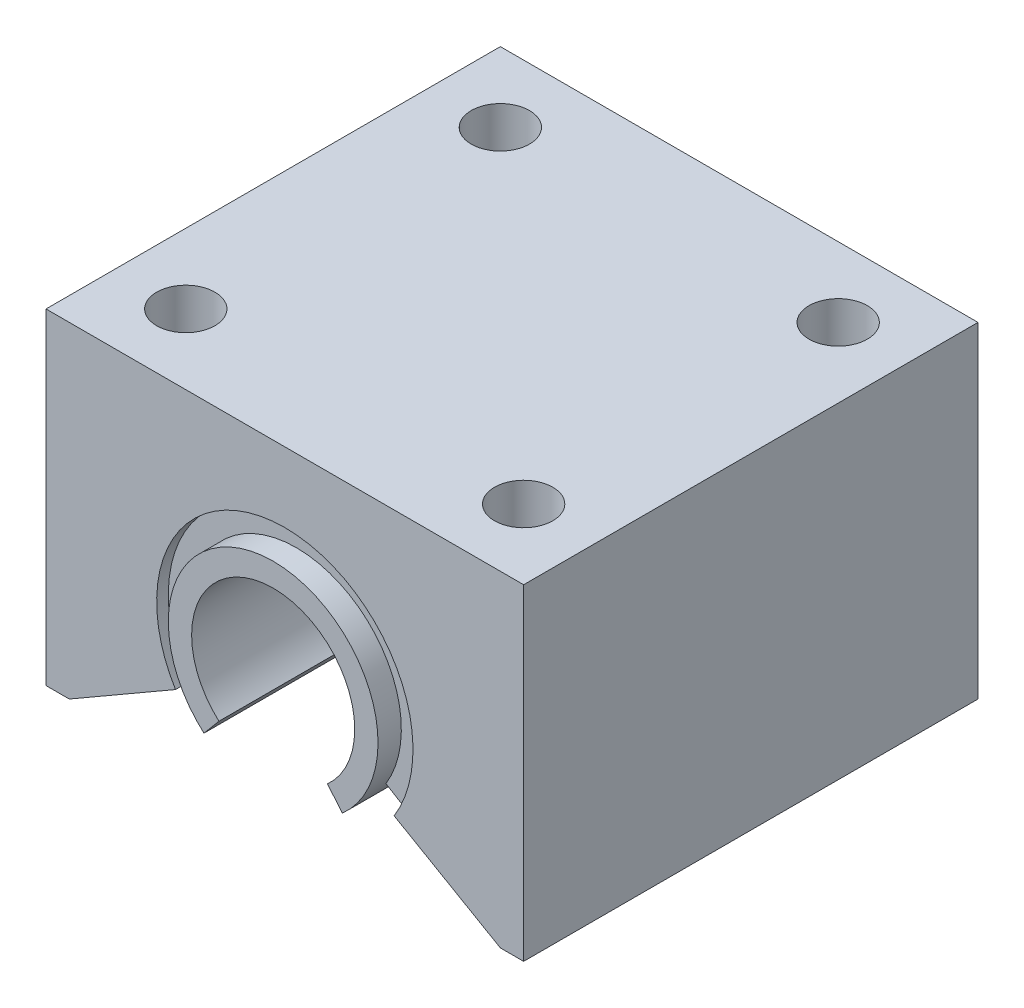
ISO-10303-21;
HEADER;
FILE_DESCRIPTION(('STEP AP214'),'2;1');
FILE_NAME('part.step','',(''),(''),'','','');
FILE_SCHEMA(('AUTOMOTIVE_DESIGN { 1 0 10303 214 1 1 1 1 }'));
ENDSEC;
DATA;
#1=APPLICATION_CONTEXT('core data for automotive mechanical design processes');
#2=APPLICATION_PROTOCOL_DEFINITION('international standard','automotive_design',2000,#1);
#3=PRODUCT_CONTEXT('',#1,'mechanical');
#4=PRODUCT('Part','Part','',(#3));
#5=PRODUCT_RELATED_PRODUCT_CATEGORY('part','',(#4));
#6=PRODUCT_DEFINITION_FORMATION('','',#4);
#7=PRODUCT_DEFINITION_CONTEXT('part definition',#1,'design');
#8=PRODUCT_DEFINITION('design','',#6,#7);
#9=PRODUCT_DEFINITION_SHAPE('','',#8);
#10=(LENGTH_UNIT() NAMED_UNIT(*) SI_UNIT(.MILLI.,.METRE.));
#11=(NAMED_UNIT(*) PLANE_ANGLE_UNIT() SI_UNIT($,.RADIAN.));
#12=(NAMED_UNIT(*) SI_UNIT($,.STERADIAN.) SOLID_ANGLE_UNIT());
#13=UNCERTAINTY_MEASURE_WITH_UNIT(LENGTH_MEASURE(1.E-05),#10,'distance_accuracy_value','');
#14=(GEOMETRIC_REPRESENTATION_CONTEXT(3) GLOBAL_UNCERTAINTY_ASSIGNED_CONTEXT((#13)) GLOBAL_UNIT_ASSIGNED_CONTEXT((#10,
#11,#12)) REPRESENTATION_CONTEXT('',''));
#15=CARTESIAN_POINT('',(0.,0.,0.));
#16=DIRECTION('',(0.,0.,1.));
#17=DIRECTION('',(1.,0.,0.));
#18=AXIS2_PLACEMENT_3D('',#15,#16,#17);
#19=CARTESIAN_POINT('',(0.,-3.,39.));
#20=DIRECTION('',(0.,0.,-1.));
#21=DIRECTION('',(-1.,0.,0.));
#22=AXIS2_PLACEMENT_3D('',#19,#20,#21);
#23=CYLINDRICAL_SURFACE('',#22,11.);
#24=CARTESIAN_POINT('',(0.,-3.,1.));
#25=DIRECTION('',(0.,0.,1.));
#26=DIRECTION('',(1.,0.,0.));
#27=AXIS2_PLACEMENT_3D('',#24,#25,#26);
#28=CIRCLE('',#27,11.);
#29=CARTESIAN_POINT('',(9.38513451930909,-8.73752996109588,1.));
#30=VERTEX_POINT('',#29);
#31=CARTESIAN_POINT('',(-9.38513451930909,-8.73752996109588,1.));
#32=VERTEX_POINT('',#31);
#33=EDGE_CURVE('E59',#30,#32,#28,.T.);
#34=ORIENTED_EDGE('',*,*,#33,.T.);
#35=DIRECTION('',(0.,0.,-1.));
#36=VECTOR('',#35,1.);
#37=CARTESIAN_POINT('',(-9.38513451930909,-8.73752996109588,39.));
#38=LINE('',#37,#36);
#39=CARTESIAN_POINT('',(-9.38513451930909,-8.73752996109588,0.));
#40=VERTEX_POINT('',#39);
#41=EDGE_CURVE('E150',#32,#40,#38,.T.);
#42=ORIENTED_EDGE('',*,*,#41,.T.);
#43=CARTESIAN_POINT('',(0.,-3.,0.));
#44=DIRECTION('',(0.,0.,-1.));
#45=DIRECTION('',(1.,0.,0.));
#46=AXIS2_PLACEMENT_3D('',#43,#44,#45);
#47=CIRCLE('',#46,11.);
#48=CARTESIAN_POINT('',(9.38513451930909,-8.73752996109588,0.));
#49=VERTEX_POINT('',#48);
#50=EDGE_CURVE('E181',#40,#49,#47,.T.);
#51=ORIENTED_EDGE('',*,*,#50,.T.);
#52=DIRECTION('',(0.,0.,-1.));
#53=VECTOR('',#52,1.);
#54=CARTESIAN_POINT('',(9.38513451930909,-8.73752996109588,39.));
#55=LINE('',#54,#53);
#56=EDGE_CURVE('E190',#30,#49,#55,.T.);
#57=ORIENTED_EDGE('',*,*,#56,.F.);
#58=EDGE_LOOP('',(#34,#42,#51,#57));
#59=FACE_BOUND('',#58,.T.);
#60=ADVANCED_FACE('F43',(#59),#23,.F.);
#61=CARTESIAN_POINT('',(18.5,-14.,39.));
#62=DIRECTION('',(0.,1.,0.));
#63=DIRECTION('',(-1.,0.,0.));
#64=AXIS2_PLACEMENT_3D('',#61,#62,#63);
#65=PLANE('',#64);
#66=DIRECTION('',(1.,0.,0.));
#67=VECTOR('',#66,1.);
#68=CARTESIAN_POINT('',(18.5,-14.,0.));
#69=LINE('',#68,#67);
#70=CARTESIAN_POINT('',(18.5,-14.,0.));
#71=VERTEX_POINT('',#70);
#72=CARTESIAN_POINT('',(20.5,-14.,0.));
#73=VERTEX_POINT('',#72);
#74=EDGE_CURVE('E162',#71,#73,#69,.T.);
#75=ORIENTED_EDGE('',*,*,#74,.T.);
#76=DIRECTION('',(0.,0.,-1.));
#77=VECTOR('',#76,1.);
#78=CARTESIAN_POINT('',(20.5,-14.,39.));
#79=LINE('',#78,#77);
#80=CARTESIAN_POINT('',(20.5,-14.,39.));
#81=VERTEX_POINT('',#80);
#82=EDGE_CURVE('E11',#81,#73,#79,.T.);
#83=ORIENTED_EDGE('',*,*,#82,.F.);
#84=DIRECTION('',(1.,0.,0.));
#85=VECTOR('',#84,1.);
#86=CARTESIAN_POINT('',(18.5,-14.,39.));
#87=LINE('',#86,#85);
#88=CARTESIAN_POINT('',(18.5,-14.,39.));
#89=VERTEX_POINT('',#88);
#90=EDGE_CURVE('E187',#89,#81,#87,.T.);
#91=ORIENTED_EDGE('',*,*,#90,.F.);
#92=DIRECTION('',(0.,0.,-1.));
#93=VECTOR('',#92,1.);
#94=CARTESIAN_POINT('',(18.5,-14.,39.));
#95=LINE('',#94,#93);
#96=EDGE_CURVE('E158',#89,#71,#95,.T.);
#97=ORIENTED_EDGE('',*,*,#96,.T.);
#98=EDGE_LOOP('',(#75,#83,#91,#97));
#99=FACE_BOUND('',#98,.T.);
#100=ADVANCED_FACE('F45',(#99),#65,.F.);
#101=CARTESIAN_POINT('',(20.5,14.,39.));
#102=DIRECTION('',(-1.,0.,0.));
#103=DIRECTION('',(0.,-1.,0.));
#104=AXIS2_PLACEMENT_3D('',#101,#102,#103);
#105=PLANE('',#104);
#106=DIRECTION('',(0.,1.,0.));
#107=VECTOR('',#106,1.);
#108=CARTESIAN_POINT('',(20.5,14.,0.));
#109=LINE('',#108,#107);
#110=CARTESIAN_POINT('',(20.5,14.,0.));
#111=VERTEX_POINT('',#110);
#112=EDGE_CURVE('E166',#73,#111,#109,.T.);
#113=ORIENTED_EDGE('',*,*,#112,.T.);
#114=DIRECTION('',(0.,0.,-1.));
#115=VECTOR('',#114,1.);
#116=CARTESIAN_POINT('',(20.5,14.,39.));
#117=LINE('',#116,#115);
#118=CARTESIAN_POINT('',(20.5,14.,39.));
#119=VERTEX_POINT('',#118);
#120=EDGE_CURVE('E52',#119,#111,#117,.T.);
#121=ORIENTED_EDGE('',*,*,#120,.F.);
#122=DIRECTION('',(0.,1.,0.));
#123=VECTOR('',#122,1.);
#124=CARTESIAN_POINT('',(20.5,14.,39.));
#125=LINE('',#124,#123);
#126=EDGE_CURVE('E108',#81,#119,#125,.T.);
#127=ORIENTED_EDGE('',*,*,#126,.F.);
#128=ORIENTED_EDGE('',*,*,#82,.T.);
#129=EDGE_LOOP('',(#113,#121,#127,#128));
#130=FACE_BOUND('',#129,.T.);
#131=ADVANCED_FACE('F423',(#130),#105,.F.);
#132=CARTESIAN_POINT('',(-20.5,14.,39.));
#133=DIRECTION('',(0.,-1.,0.));
#134=DIRECTION('',(0.,0.,-1.));
#135=AXIS2_PLACEMENT_3D('',#132,#133,#134);
#136=PLANE('',#135);
#137=CARTESIAN_POINT('',(-14.4999987013249,14.,33.));
#138=DIRECTION('',(0.,1.,0.));
#139=DIRECTION('',(0.,0.,1.));
#140=AXIS2_PLACEMENT_3D('',#137,#138,#139);
#141=CIRCLE('',#140,2.5);
#142=CARTESIAN_POINT('',(-14.4999987013249,14.,35.5));
#143=VERTEX_POINT('',#142);
#144=EDGE_CURVE('E333',#143,#143,#141,.T.);
#145=ORIENTED_EDGE('',*,*,#144,.F.);
#146=EDGE_LOOP('',(#145));
#147=FACE_BOUND('',#146,.T.);
#148=CARTESIAN_POINT('',(14.5,14.,33.));
#149=DIRECTION('',(0.,1.,0.));
#150=DIRECTION('',(0.,0.,1.));
#151=AXIS2_PLACEMENT_3D('',#148,#149,#150);
#152=CIRCLE('',#151,2.5);
#153=CARTESIAN_POINT('',(14.5,14.,35.5));
#154=VERTEX_POINT('',#153);
#155=EDGE_CURVE('E342',#154,#154,#152,.T.);
#156=ORIENTED_EDGE('',*,*,#155,.F.);
#157=EDGE_LOOP('',(#156));
#158=FACE_BOUND('',#157,.T.);
#159=CARTESIAN_POINT('',(14.4999987013249,14.,6.));
#160=DIRECTION('',(0.,1.,0.));
#161=DIRECTION('',(0.,0.,1.));
#162=AXIS2_PLACEMENT_3D('',#159,#160,#161);
#163=CIRCLE('',#162,2.5);
#164=CARTESIAN_POINT('',(14.4999987013249,14.,8.5));
#165=VERTEX_POINT('',#164);
#166=EDGE_CURVE('E350',#165,#165,#163,.T.);
#167=ORIENTED_EDGE('',*,*,#166,.F.);
#168=EDGE_LOOP('',(#167));
#169=FACE_BOUND('',#168,.T.);
#170=CARTESIAN_POINT('',(-14.5,14.,6.));
#171=DIRECTION('',(0.,1.,0.));
#172=DIRECTION('',(0.,0.,1.));
#173=AXIS2_PLACEMENT_3D('',#170,#171,#172);
#174=CIRCLE('',#173,2.5);
#175=CARTESIAN_POINT('',(-14.5,14.,8.5));
#176=VERTEX_POINT('',#175);
#177=EDGE_CURVE('E325',#176,#176,#174,.T.);
#178=ORIENTED_EDGE('',*,*,#177,.F.);
#179=EDGE_LOOP('',(#178));
#180=FACE_BOUND('',#179,.T.);
#181=DIRECTION('',(-1.,0.,0.));
#182=VECTOR('',#181,1.);
#183=CARTESIAN_POINT('',(-20.5,14.,0.));
#184=LINE('',#183,#182);
#185=CARTESIAN_POINT('',(-20.5,14.,0.));
#186=VERTEX_POINT('',#185);
#187=EDGE_CURVE('E169',#111,#186,#184,.T.);
#188=ORIENTED_EDGE('',*,*,#187,.T.);
#189=DIRECTION('',(0.,0.,-1.));
#190=VECTOR('',#189,1.);
#191=CARTESIAN_POINT('',(-20.5,14.,39.));
#192=LINE('',#191,#190);
#193=CARTESIAN_POINT('',(-20.5,14.,39.));
#194=VERTEX_POINT('',#193);
#195=EDGE_CURVE('E199',#194,#186,#192,.T.);
#196=ORIENTED_EDGE('',*,*,#195,.F.);
#197=DIRECTION('',(-1.,0.,0.));
#198=VECTOR('',#197,1.);
#199=CARTESIAN_POINT('',(-20.5,14.,39.));
#200=LINE('',#199,#198);
#201=EDGE_CURVE('E209',#119,#194,#200,.T.);
#202=ORIENTED_EDGE('',*,*,#201,.F.);
#203=ORIENTED_EDGE('',*,*,#120,.T.);
#204=EDGE_LOOP('',(#188,#196,#202,#203));
#205=FACE_BOUND('',#204,.T.);
#206=ADVANCED_FACE('F207',(#147,#158,#169,#180,#205),#136,.F.);
#207=CARTESIAN_POINT('',(-20.5,14.,39.));
#208=DIRECTION('',(1.,0.,0.));
#209=DIRECTION('',(0.,1.,0.));
#210=AXIS2_PLACEMENT_3D('',#207,#208,#209);
#211=PLANE('',#210);
#212=DIRECTION('',(0.,-1.,0.));
#213=VECTOR('',#212,1.);
#214=CARTESIAN_POINT('',(-20.5,14.,0.));
#215=LINE('',#214,#213);
#216=CARTESIAN_POINT('',(-20.5,-14.,0.));
#217=VERTEX_POINT('',#216);
#218=EDGE_CURVE('E172',#186,#217,#215,.T.);
#219=ORIENTED_EDGE('',*,*,#218,.T.);
#220=DIRECTION('',(0.,0.,-1.));
#221=VECTOR('',#220,1.);
#222=CARTESIAN_POINT('',(-20.5,-14.,39.));
#223=LINE('',#222,#221);
#224=CARTESIAN_POINT('',(-20.5,-14.,39.));
#225=VERTEX_POINT('',#224);
#226=EDGE_CURVE('E195',#225,#217,#223,.T.);
#227=ORIENTED_EDGE('',*,*,#226,.F.);
#228=DIRECTION('',(0.,-1.,0.));
#229=VECTOR('',#228,1.);
#230=CARTESIAN_POINT('',(-20.5,14.,39.));
#231=LINE('',#230,#229);
#232=EDGE_CURVE('E223',#194,#225,#231,.T.);
#233=ORIENTED_EDGE('',*,*,#232,.F.);
#234=ORIENTED_EDGE('',*,*,#195,.T.);
#235=EDGE_LOOP('',(#219,#227,#233,#234));
#236=FACE_BOUND('',#235,.T.);
#237=ADVANCED_FACE('F218',(#236),#211,.F.);
#238=CARTESIAN_POINT('',(-20.5,-14.,39.));
#239=DIRECTION('',(0.,1.,0.));
#240=DIRECTION('',(-1.,0.,0.));
#241=AXIS2_PLACEMENT_3D('',#238,#239,#240);
#242=PLANE('',#241);
#243=DIRECTION('',(1.,0.,0.));
#244=VECTOR('',#243,1.);
#245=CARTESIAN_POINT('',(-20.5,-14.,0.));
#246=LINE('',#245,#244);
#247=CARTESIAN_POINT('',(-18.5,-14.,0.));
#248=VERTEX_POINT('',#247);
#249=EDGE_CURVE('E175',#217,#248,#246,.T.);
#250=ORIENTED_EDGE('',*,*,#249,.T.);
#251=DIRECTION('',(0.,0.,-1.));
#252=VECTOR('',#251,1.);
#253=CARTESIAN_POINT('',(-18.5,-14.,39.));
#254=LINE('',#253,#252);
#255=CARTESIAN_POINT('',(-18.5,-14.,39.));
#256=VERTEX_POINT('',#255);
#257=EDGE_CURVE('E149',#256,#248,#254,.T.);
#258=ORIENTED_EDGE('',*,*,#257,.F.);
#259=DIRECTION('',(1.,0.,0.));
#260=VECTOR('',#259,1.);
#261=CARTESIAN_POINT('',(-20.5,-14.,39.));
#262=LINE('',#261,#260);
#263=EDGE_CURVE('E131',#225,#256,#262,.T.);
#264=ORIENTED_EDGE('',*,*,#263,.F.);
#265=ORIENTED_EDGE('',*,*,#226,.T.);
#266=EDGE_LOOP('',(#250,#258,#264,#265));
#267=FACE_BOUND('',#266,.T.);
#268=ADVANCED_FACE('F221',(#267),#242,.F.);
#269=CARTESIAN_POINT('',(-18.5,-14.,39.));
#270=DIRECTION('',(-0.5,0.866025403784439,0.));
#271=DIRECTION('',(-0.866025403784439,-0.5,0.));
#272=AXIS2_PLACEMENT_3D('',#269,#270,#271);
#273=PLANE('',#272);
#274=DIRECTION('',(0.866025403784439,0.5,0.));
#275=VECTOR('',#274,1.);
#276=CARTESIAN_POINT('',(-18.5,-14.,0.));
#277=LINE('',#276,#275);
#278=EDGE_CURVE('E178',#248,#40,#277,.T.);
#279=ORIENTED_EDGE('',*,*,#278,.T.);
#280=ORIENTED_EDGE('',*,*,#41,.F.);
#281=DIRECTION('',(0.,0.,-1.));
#282=VECTOR('',#281,1.);
#283=CARTESIAN_POINT('',(-9.38513451930909,-8.73752996109588,38.));
#284=LINE('',#283,#282);
#285=CARTESIAN_POINT('',(-9.38513451930909,-8.73752996109588,38.));
#286=VERTEX_POINT('',#285);
#287=EDGE_CURVE('E145',#286,#32,#284,.T.);
#288=ORIENTED_EDGE('',*,*,#287,.F.);
#289=CARTESIAN_POINT('',(-9.38513451930909,-8.73752996109588,39.));
#290=VERTEX_POINT('',#289);
#291=EDGE_CURVE('E139',#290,#286,#38,.T.);
#292=ORIENTED_EDGE('',*,*,#291,.F.);
#293=DIRECTION('',(0.866025403784439,0.5,0.));
#294=VECTOR('',#293,1.);
#295=CARTESIAN_POINT('',(-18.5,-14.,39.));
#296=LINE('',#295,#294);
#297=EDGE_CURVE('E124',#256,#290,#296,.T.);
#298=ORIENTED_EDGE('',*,*,#297,.F.);
#299=ORIENTED_EDGE('',*,*,#257,.T.);
#300=EDGE_LOOP('',(#279,#280,#288,#292,#298,#299));
#301=FACE_BOUND('',#300,.T.);
#302=ADVANCED_FACE('F141',(#301),#273,.F.);
#303=ORIENTED_EDGE('',*,*,#291,.T.);
#304=CARTESIAN_POINT('',(0.,-3.,38.));
#305=DIRECTION('',(0.,0.,1.));
#306=DIRECTION('',(1.,0.,0.));
#307=AXIS2_PLACEMENT_3D('',#304,#305,#306);
#308=CIRCLE('',#307,11.);
#309=CARTESIAN_POINT('',(9.38513451930905,-8.73752996109594,38.));
#310=VERTEX_POINT('',#309);
#311=EDGE_CURVE('E251',#310,#286,#308,.T.);
#312=ORIENTED_EDGE('',*,*,#311,.F.);
#313=CARTESIAN_POINT('',(9.38513451930909,-8.73752996109588,39.));
#314=VERTEX_POINT('',#313);
#315=EDGE_CURVE('E154',#314,#310,#55,.T.);
#316=ORIENTED_EDGE('',*,*,#315,.F.);
#317=CARTESIAN_POINT('',(0.,-3.,39.));
#318=DIRECTION('',(0.,0.,-1.));
#319=DIRECTION('',(1.,0.,0.));
#320=AXIS2_PLACEMENT_3D('',#317,#318,#319);
#321=CIRCLE('',#320,11.);
#322=EDGE_CURVE('E128',#290,#314,#321,.T.);
#323=ORIENTED_EDGE('',*,*,#322,.F.);
#324=EDGE_LOOP('',(#303,#312,#316,#323));
#325=FACE_BOUND('',#324,.T.);
#326=ADVANCED_FACE('F152',(#325),#23,.F.);
#327=CARTESIAN_POINT('',(18.5,-14.,39.));
#328=DIRECTION('',(0.500000000000001,0.866025403784438,0.));
#329=DIRECTION('',(-0.866025403784438,0.500000000000001,0.));
#330=AXIS2_PLACEMENT_3D('',#327,#328,#329);
#331=PLANE('',#330);
#332=DIRECTION('',(0.866025403784438,-0.500000000000001,0.));
#333=VECTOR('',#332,1.);
#334=CARTESIAN_POINT('',(18.5,-14.,0.));
#335=LINE('',#334,#333);
#336=EDGE_CURVE('E100',#49,#71,#335,.T.);
#337=ORIENTED_EDGE('',*,*,#336,.T.);
#338=ORIENTED_EDGE('',*,*,#96,.F.);
#339=DIRECTION('',(0.866025403784438,-0.500000000000001,0.));
#340=VECTOR('',#339,1.);
#341=CARTESIAN_POINT('',(18.5,-14.,39.));
#342=LINE('',#341,#340);
#343=EDGE_CURVE('E68',#314,#89,#342,.T.);
#344=ORIENTED_EDGE('',*,*,#343,.F.);
#345=ORIENTED_EDGE('',*,*,#315,.T.);
#346=DIRECTION('',(0.,0.,-1.));
#347=VECTOR('',#346,1.);
#348=CARTESIAN_POINT('',(9.38513451930905,-8.73752996109594,38.));
#349=LINE('',#348,#347);
#350=EDGE_CURVE('E243',#310,#30,#349,.T.);
#351=ORIENTED_EDGE('',*,*,#350,.T.);
#352=ORIENTED_EDGE('',*,*,#56,.T.);
#353=EDGE_LOOP('',(#337,#338,#344,#345,#351,#352));
#354=FACE_BOUND('',#353,.T.);
#355=ADVANCED_FACE('F459',(#354),#331,.F.);
#356=CARTESIAN_POINT('',(0.,-3.,39.));
#357=DIRECTION('',(0.,0.,1.));
#358=DIRECTION('',(1.,0.,0.));
#359=AXIS2_PLACEMENT_3D('',#356,#357,#358);
#360=PLANE('',#359);
#361=ORIENTED_EDGE('',*,*,#90,.T.);
#362=ORIENTED_EDGE('',*,*,#126,.T.);
#363=ORIENTED_EDGE('',*,*,#201,.T.);
#364=ORIENTED_EDGE('',*,*,#232,.T.);
#365=ORIENTED_EDGE('',*,*,#263,.T.);
#366=ORIENTED_EDGE('',*,*,#297,.T.);
#367=ORIENTED_EDGE('',*,*,#322,.T.);
#368=ORIENTED_EDGE('',*,*,#343,.T.);
#369=EDGE_LOOP('',(#361,#362,#363,#364,#365,#366,#367,#368));
#370=FACE_BOUND('',#369,.T.);
#371=ADVANCED_FACE('F126',(#370),#360,.T.);
#372=CARTESIAN_POINT('',(0.,-3.,0.));
#373=DIRECTION('',(0.,0.,1.));
#374=DIRECTION('',(1.,0.,0.));
#375=AXIS2_PLACEMENT_3D('',#372,#373,#374);
#376=PLANE('',#375);
#377=ORIENTED_EDGE('',*,*,#74,.F.);
#378=ORIENTED_EDGE('',*,*,#336,.F.);
#379=ORIENTED_EDGE('',*,*,#50,.F.);
#380=ORIENTED_EDGE('',*,*,#278,.F.);
#381=ORIENTED_EDGE('',*,*,#249,.F.);
#382=ORIENTED_EDGE('',*,*,#218,.F.);
#383=ORIENTED_EDGE('',*,*,#187,.F.);
#384=ORIENTED_EDGE('',*,*,#112,.F.);
#385=EDGE_LOOP('',(#377,#378,#379,#380,#381,#382,#383,#384));
#386=FACE_BOUND('',#385,.T.);
#387=ADVANCED_FACE('F213',(#386),#376,.F.);
#388=CARTESIAN_POINT('',(-9.38513451930909,-8.73752996109588,38.));
#389=DIRECTION('',(-0.521593632826898,0.853194047209918,0.));
#390=DIRECTION('',(-0.853194047209918,-0.521593632826898,0.));
#391=AXIS2_PLACEMENT_3D('',#388,#389,#390);
#392=PLANE('',#391);
#393=DIRECTION('',(0.853194047209918,0.521593632826898,0.));
#394=VECTOR('',#393,1.);
#395=CARTESIAN_POINT('',(-9.38513451930909,-8.73752996109588,1.));
#396=LINE('',#395,#394);
#397=CARTESIAN_POINT('',(-7.67874642488926,-7.69434269544209,1.));
#398=VERTEX_POINT('',#397);
#399=EDGE_CURVE('E256',#32,#398,#396,.T.);
#400=ORIENTED_EDGE('',*,*,#399,.T.);
#401=DIRECTION('',(0.,0.,-1.));
#402=VECTOR('',#401,1.);
#403=CARTESIAN_POINT('',(-7.67874642488926,-7.69434269544209,38.));
#404=LINE('',#403,#402);
#405=CARTESIAN_POINT('',(-7.67874642488926,-7.69434269544209,38.));
#406=VERTEX_POINT('',#405);
#407=EDGE_CURVE('E235',#406,#398,#404,.T.);
#408=ORIENTED_EDGE('',*,*,#407,.F.);
#409=DIRECTION('',(0.853194047209918,0.521593632826898,0.));
#410=VECTOR('',#409,1.);
#411=CARTESIAN_POINT('',(-9.38513451930909,-8.73752996109588,38.));
#412=LINE('',#411,#410);
#413=EDGE_CURVE('E270',#286,#406,#412,.T.);
#414=ORIENTED_EDGE('',*,*,#413,.F.);
#415=ORIENTED_EDGE('',*,*,#287,.T.);
#416=EDGE_LOOP('',(#400,#408,#414,#415));
#417=FACE_BOUND('',#416,.T.);
#418=ADVANCED_FACE('F823',(#417),#392,.F.);
#419=CARTESIAN_POINT('',(9.38513451930905,-8.73752996109594,38.));
#420=DIRECTION('',(0.521593632826904,0.853194047209914,0.));
#421=DIRECTION('',(-0.853194047209914,0.521593632826904,0.));
#422=AXIS2_PLACEMENT_3D('',#419,#420,#421);
#423=PLANE('',#422);
#424=DIRECTION('',(0.853194047209914,-0.521593632826904,0.));
#425=VECTOR('',#424,1.);
#426=CARTESIAN_POINT('',(9.38513451930905,-8.73752996109594,1.));
#427=LINE('',#426,#425);
#428=CARTESIAN_POINT('',(7.67874642488923,-7.69434269544213,1.));
#429=VERTEX_POINT('',#428);
#430=EDGE_CURVE('E248',#429,#30,#427,.T.);
#431=ORIENTED_EDGE('',*,*,#430,.T.);
#432=ORIENTED_EDGE('',*,*,#350,.F.);
#433=DIRECTION('',(0.853194047209914,-0.521593632826904,0.));
#434=VECTOR('',#433,1.);
#435=CARTESIAN_POINT('',(9.38513451930905,-8.73752996109594,38.));
#436=LINE('',#435,#434);
#437=CARTESIAN_POINT('',(7.67874642488922,-7.69434269544213,38.));
#438=VERTEX_POINT('',#437);
#439=EDGE_CURVE('E247',#438,#310,#436,.T.);
#440=ORIENTED_EDGE('',*,*,#439,.F.);
#441=DIRECTION('',(0.,0.,-1.));
#442=VECTOR('',#441,1.);
#443=CARTESIAN_POINT('',(7.67874642488922,-7.69434269544213,38.));
#444=LINE('',#443,#442);
#445=EDGE_CURVE('E239',#438,#429,#444,.T.);
#446=ORIENTED_EDGE('',*,*,#445,.T.);
#447=EDGE_LOOP('',(#431,#432,#440,#446));
#448=FACE_BOUND('',#447,.T.);
#449=ADVANCED_FACE('F483',(#448),#423,.F.);
#450=CARTESIAN_POINT('',(0.,-3.,38.));
#451=DIRECTION('',(0.,0.,1.));
#452=DIRECTION('',(1.,0.,0.));
#453=AXIS2_PLACEMENT_3D('',#450,#451,#452);
#454=PLANE('',#453);
#455=ORIENTED_EDGE('',*,*,#311,.T.);
#456=ORIENTED_EDGE('',*,*,#413,.T.);
#457=CARTESIAN_POINT('',(0.,-3.,38.));
#458=DIRECTION('',(0.,0.,-1.));
#459=DIRECTION('',(1.,0.,0.));
#460=AXIS2_PLACEMENT_3D('',#457,#458,#459);
#461=CIRCLE('',#460,9.);
#462=EDGE_CURVE('E266',#406,#438,#461,.T.);
#463=ORIENTED_EDGE('',*,*,#462,.T.);
#464=ORIENTED_EDGE('',*,*,#439,.T.);
#465=EDGE_LOOP('',(#455,#456,#463,#464));
#466=FACE_BOUND('',#465,.T.);
#467=ADVANCED_FACE('F488',(#466),#454,.T.);
#468=CARTESIAN_POINT('',(0.,-3.,1.));
#469=DIRECTION('',(0.,0.,1.));
#470=DIRECTION('',(1.,0.,0.));
#471=AXIS2_PLACEMENT_3D('',#468,#469,#470);
#472=PLANE('',#471);
#473=ORIENTED_EDGE('',*,*,#33,.F.);
#474=ORIENTED_EDGE('',*,*,#430,.F.);
#475=CARTESIAN_POINT('',(0.,-3.,1.));
#476=DIRECTION('',(0.,0.,-1.));
#477=DIRECTION('',(1.,0.,0.));
#478=AXIS2_PLACEMENT_3D('',#475,#476,#477);
#479=CIRCLE('',#478,9.);
#480=EDGE_CURVE('E252',#398,#429,#479,.T.);
#481=ORIENTED_EDGE('',*,*,#480,.F.);
#482=ORIENTED_EDGE('',*,*,#399,.F.);
#483=EDGE_LOOP('',(#473,#474,#481,#482));
#484=FACE_BOUND('',#483,.T.);
#485=ADVANCED_FACE('F800',(#484),#472,.F.);
#486=CARTESIAN_POINT('',(0.,-3.,40.));
#487=DIRECTION('',(0.,0.,-1.));
#488=DIRECTION('',(-1.,0.,0.));
#489=AXIS2_PLACEMENT_3D('',#486,#487,#488);
#490=CYLINDRICAL_SURFACE('',#489,9.);
#491=ORIENTED_EDGE('',*,*,#462,.F.);
#492=ORIENTED_EDGE('',*,*,#407,.T.);
#493=ORIENTED_EDGE('',*,*,#480,.T.);
#494=ORIENTED_EDGE('',*,*,#445,.F.);
#495=EDGE_LOOP('',(#491,#492,#493,#494));
#496=FACE_BOUND('',#495,.T.);
#497=CARTESIAN_POINT('',(0.,-3.,-1.));
#498=DIRECTION('',(0.,0.,1.));
#499=DIRECTION('',(1.,0.,0.));
#500=AXIS2_PLACEMENT_3D('',#497,#498,#499);
#501=CIRCLE('',#500,9.);
#502=CARTESIAN_POINT('',(5.94194790038679,-9.75967862764858,-1.));
#503=VERTEX_POINT('',#502);
#504=CARTESIAN_POINT('',(-5.94194790038679,-9.75967862764858,-1.));
#505=VERTEX_POINT('',#504);
#506=EDGE_CURVE('E306',#503,#505,#501,.T.);
#507=ORIENTED_EDGE('',*,*,#506,.T.);
#508=DIRECTION('',(0.,0.,-1.));
#509=VECTOR('',#508,1.);
#510=CARTESIAN_POINT('',(-5.94194790038679,-9.75967862764858,40.));
#511=LINE('',#510,#509);
#512=CARTESIAN_POINT('',(-5.94194790038679,-9.75967862764858,40.));
#513=VERTEX_POINT('',#512);
#514=EDGE_CURVE('E262',#513,#505,#511,.T.);
#515=ORIENTED_EDGE('',*,*,#514,.F.);
#516=CARTESIAN_POINT('',(0.,-3.,40.));
#517=DIRECTION('',(0.,0.,1.));
#518=DIRECTION('',(1.,0.,0.));
#519=AXIS2_PLACEMENT_3D('',#516,#517,#518);
#520=CIRCLE('',#519,9.);
#521=CARTESIAN_POINT('',(5.94194790038679,-9.75967862764858,40.));
#522=VERTEX_POINT('',#521);
#523=EDGE_CURVE('E297',#522,#513,#520,.T.);
#524=ORIENTED_EDGE('',*,*,#523,.F.);
#525=DIRECTION('',(0.,0.,-1.));
#526=VECTOR('',#525,1.);
#527=CARTESIAN_POINT('',(5.94194790038679,-9.75967862764858,40.));
#528=LINE('',#527,#526);
#529=EDGE_CURVE('E288',#522,#503,#528,.T.);
#530=ORIENTED_EDGE('',*,*,#529,.T.);
#531=EDGE_LOOP('',(#507,#515,#524,#530));
#532=FACE_BOUND('',#531,.T.);
#533=ADVANCED_FACE('F792',(#496,#532),#490,.T.);
#534=CARTESIAN_POINT('',(-5.94194790038679,-9.75967862764858,40.));
#535=DIRECTION('',(-0.766044443118979,0.642787609686538,0.));
#536=DIRECTION('',(-0.642787609686538,-0.766044443118979,0.));
#537=AXIS2_PLACEMENT_3D('',#534,#535,#536);
#538=PLANE('',#537);
#539=DIRECTION('',(0.642787609686538,0.766044443118979,0.));
#540=VECTOR('',#539,1.);
#541=CARTESIAN_POINT('',(-5.94194790038679,-9.75967862764858,-1.));
#542=LINE('',#541,#540);
#543=CARTESIAN_POINT('',(-4.65593628630316,-8.22706966644654,-1.));
#544=VERTEX_POINT('',#543);
#545=EDGE_CURVE('E302',#505,#544,#542,.T.);
#546=ORIENTED_EDGE('',*,*,#545,.T.);
#547=DIRECTION('',(0.,0.,-1.));
#548=VECTOR('',#547,1.);
#549=CARTESIAN_POINT('',(-4.65593628630316,-8.22706966644654,40.));
#550=LINE('',#549,#548);
#551=CARTESIAN_POINT('',(-4.65593628630316,-8.22706966644654,40.));
#552=VERTEX_POINT('',#551);
#553=EDGE_CURVE('E280',#552,#544,#550,.T.);
#554=ORIENTED_EDGE('',*,*,#553,.F.);
#555=DIRECTION('',(0.642787609686538,0.766044443118979,0.));
#556=VECTOR('',#555,1.);
#557=CARTESIAN_POINT('',(-5.94194790038679,-9.75967862764858,40.));
#558=LINE('',#557,#556);
#559=EDGE_CURVE('E318',#513,#552,#558,.T.);
#560=ORIENTED_EDGE('',*,*,#559,.F.);
#561=ORIENTED_EDGE('',*,*,#514,.T.);
#562=EDGE_LOOP('',(#546,#554,#560,#561));
#563=FACE_BOUND('',#562,.T.);
#564=ADVANCED_FACE('F783',(#563),#538,.F.);
#565=CARTESIAN_POINT('',(0.,-3.,40.));
#566=DIRECTION('',(0.,0.,-1.));
#567=DIRECTION('',(-1.,0.,0.));
#568=AXIS2_PLACEMENT_3D('',#565,#566,#567);
#569=CYLINDRICAL_SURFACE('',#568,7.);
#570=CARTESIAN_POINT('',(0.,-3.,-1.));
#571=DIRECTION('',(0.,0.,-1.));
#572=DIRECTION('',(1.,0.,0.));
#573=AXIS2_PLACEMENT_3D('',#570,#571,#572);
#574=CIRCLE('',#573,7.);
#575=CARTESIAN_POINT('',(4.65593628630316,-8.22706966644653,-1.));
#576=VERTEX_POINT('',#575);
#577=EDGE_CURVE('E298',#544,#576,#574,.T.);
#578=ORIENTED_EDGE('',*,*,#577,.T.);
#579=DIRECTION('',(0.,0.,-1.));
#580=VECTOR('',#579,1.);
#581=CARTESIAN_POINT('',(4.65593628630316,-8.22706966644653,40.));
#582=LINE('',#581,#580);
#583=CARTESIAN_POINT('',(4.65593628630316,-8.22706966644653,40.));
#584=VERTEX_POINT('',#583);
#585=EDGE_CURVE('E284',#584,#576,#582,.T.);
#586=ORIENTED_EDGE('',*,*,#585,.F.);
#587=CARTESIAN_POINT('',(0.,-3.,40.));
#588=DIRECTION('',(0.,0.,-1.));
#589=DIRECTION('',(1.,0.,0.));
#590=AXIS2_PLACEMENT_3D('',#587,#588,#589);
#591=CIRCLE('',#590,7.);
#592=EDGE_CURVE('E314',#552,#584,#591,.T.);
#593=ORIENTED_EDGE('',*,*,#592,.F.);
#594=ORIENTED_EDGE('',*,*,#553,.T.);
#595=EDGE_LOOP('',(#578,#586,#593,#594));
#596=FACE_BOUND('',#595,.T.);
#597=ADVANCED_FACE('F775',(#596),#569,.F.);
#598=CARTESIAN_POINT('',(5.94194790038679,-9.75967862764858,40.));
#599=DIRECTION('',(0.766044443118979,0.642787609686538,0.));
#600=DIRECTION('',(-0.642787609686538,0.766044443118979,0.));
#601=AXIS2_PLACEMENT_3D('',#598,#599,#600);
#602=PLANE('',#601);
#603=DIRECTION('',(0.642787609686538,-0.766044443118979,0.));
#604=VECTOR('',#603,1.);
#605=CARTESIAN_POINT('',(5.94194790038679,-9.75967862764858,-1.));
#606=LINE('',#605,#604);
#607=EDGE_CURVE('E293',#576,#503,#606,.T.);
#608=ORIENTED_EDGE('',*,*,#607,.T.);
#609=ORIENTED_EDGE('',*,*,#529,.F.);
#610=DIRECTION('',(0.642787609686538,-0.766044443118979,0.));
#611=VECTOR('',#610,1.);
#612=CARTESIAN_POINT('',(5.94194790038679,-9.75967862764858,40.));
#613=LINE('',#612,#611);
#614=EDGE_CURVE('E292',#584,#522,#613,.T.);
#615=ORIENTED_EDGE('',*,*,#614,.F.);
#616=ORIENTED_EDGE('',*,*,#585,.T.);
#617=EDGE_LOOP('',(#608,#609,#615,#616));
#618=FACE_BOUND('',#617,.T.);
#619=ADVANCED_FACE('F768',(#618),#602,.F.);
#620=CARTESIAN_POINT('',(0.,-3.,40.));
#621=DIRECTION('',(0.,0.,1.));
#622=DIRECTION('',(1.,0.,0.));
#623=AXIS2_PLACEMENT_3D('',#620,#621,#622);
#624=PLANE('',#623);
#625=ORIENTED_EDGE('',*,*,#523,.T.);
#626=ORIENTED_EDGE('',*,*,#559,.T.);
#627=ORIENTED_EDGE('',*,*,#592,.T.);
#628=ORIENTED_EDGE('',*,*,#614,.T.);
#629=EDGE_LOOP('',(#625,#626,#627,#628));
#630=FACE_BOUND('',#629,.T.);
#631=ADVANCED_FACE('F444',(#630),#624,.T.);
#632=CARTESIAN_POINT('',(0.,-3.,-1.));
#633=DIRECTION('',(0.,0.,1.));
#634=DIRECTION('',(1.,0.,0.));
#635=AXIS2_PLACEMENT_3D('',#632,#633,#634);
#636=PLANE('',#635);
#637=ORIENTED_EDGE('',*,*,#506,.F.);
#638=ORIENTED_EDGE('',*,*,#607,.F.);
#639=ORIENTED_EDGE('',*,*,#577,.F.);
#640=ORIENTED_EDGE('',*,*,#545,.F.);
#641=EDGE_LOOP('',(#637,#638,#639,#640));
#642=FACE_BOUND('',#641,.T.);
#643=ADVANCED_FACE('F434',(#642),#636,.F.);
#644=CARTESIAN_POINT('',(-14.5,4.00000000000001,6.));
#645=DIRECTION('',(0.,1.,0.));
#646=DIRECTION('',(0.,0.,1.));
#647=AXIS2_PLACEMENT_3D('',#644,#645,#646);
#648=CYLINDRICAL_SURFACE('',#647,2.5);
#649=CARTESIAN_POINT('',(-14.5,4.00000000000001,6.));
#650=DIRECTION('',(0.,1.,0.));
#651=DIRECTION('',(0.,0.,1.));
#652=AXIS2_PLACEMENT_3D('',#649,#650,#651);
#653=CIRCLE('',#652,2.5);
#654=CARTESIAN_POINT('',(-14.5,4.00000000000001,8.5));
#655=VERTEX_POINT('',#654);
#656=EDGE_CURVE('E310',#655,#655,#653,.T.);
#657=ORIENTED_EDGE('',*,*,#656,.F.);
#658=EDGE_LOOP('',(#657));
#659=FACE_BOUND('',#658,.T.);
#660=ORIENTED_EDGE('',*,*,#177,.T.);
#661=EDGE_LOOP('',(#660));
#662=FACE_BOUND('',#661,.T.);
#663=ADVANCED_FACE('F431',(#659,#662),#648,.F.);
#664=CARTESIAN_POINT('',(-14.5,4.00000000000001,6.));
#665=DIRECTION('',(0.,1.,0.));
#666=DIRECTION('',(0.,0.,1.));
#667=AXIS2_PLACEMENT_3D('',#664,#665,#666);
#668=PLANE('',#667);
#669=CARTESIAN_POINT('',(-14.5,4.00000000000001,6.));
#670=DIRECTION('',(0.,1.,0.));
#671=DIRECTION('',(0.,0.,1.));
#672=AXIS2_PLACEMENT_3D('',#669,#670,#671);
#673=CIRCLE('',#672,2.125);
#674=CARTESIAN_POINT('',(-14.5,4.00000000000001,8.125));
#675=VERTEX_POINT('',#674);
#676=EDGE_CURVE('E388',#675,#675,#673,.T.);
#677=ORIENTED_EDGE('',*,*,#676,.F.);
#678=EDGE_LOOP('',(#677));
#679=FACE_BOUND('',#678,.T.);
#680=ORIENTED_EDGE('',*,*,#656,.T.);
#681=EDGE_LOOP('',(#680));
#682=FACE_BOUND('',#681,.T.);
#683=ADVANCED_FACE('F433',(#679,#682),#668,.T.);
#684=CARTESIAN_POINT('',(14.4999987013249,4.00000000000001,6.));
#685=DIRECTION('',(0.,1.,0.));
#686=DIRECTION('',(0.,0.,1.));
#687=AXIS2_PLACEMENT_3D('',#684,#685,#686);
#688=CYLINDRICAL_SURFACE('',#687,2.5);
#689=CARTESIAN_POINT('',(14.4999987013249,4.00000000000001,6.));
#690=DIRECTION('',(0.,1.,0.));
#691=DIRECTION('',(0.,0.,1.));
#692=AXIS2_PLACEMENT_3D('',#689,#690,#691);
#693=CIRCLE('',#692,2.5);
#694=CARTESIAN_POINT('',(14.4999987013249,4.00000000000001,8.5));
#695=VERTEX_POINT('',#694);
#696=EDGE_CURVE('E329',#695,#695,#693,.T.);
#697=ORIENTED_EDGE('',*,*,#696,.F.);
#698=EDGE_LOOP('',(#697));
#699=FACE_BOUND('',#698,.T.);
#700=ORIENTED_EDGE('',*,*,#166,.T.);
#701=EDGE_LOOP('',(#700));
#702=FACE_BOUND('',#701,.T.);
#703=ADVANCED_FACE('F441',(#699,#702),#688,.F.);
#704=CARTESIAN_POINT('',(14.4999987013249,4.00000000000001,6.));
#705=DIRECTION('',(0.,1.,0.));
#706=DIRECTION('',(0.,0.,1.));
#707=AXIS2_PLACEMENT_3D('',#704,#705,#706);
#708=PLANE('',#707);
#709=CARTESIAN_POINT('',(14.4999987013249,4.00000000000001,6.));
#710=DIRECTION('',(0.,1.,0.));
#711=DIRECTION('',(0.,0.,1.));
#712=AXIS2_PLACEMENT_3D('',#709,#710,#711);
#713=CIRCLE('',#712,2.125);
#714=CARTESIAN_POINT('',(14.4999987013249,4.00000000000001,8.125));
#715=VERTEX_POINT('',#714);
#716=EDGE_CURVE('E376',#715,#715,#713,.T.);
#717=ORIENTED_EDGE('',*,*,#716,.F.);
#718=EDGE_LOOP('',(#717));
#719=FACE_BOUND('',#718,.T.);
#720=ORIENTED_EDGE('',*,*,#696,.T.);
#721=EDGE_LOOP('',(#720));
#722=FACE_BOUND('',#721,.T.);
#723=ADVANCED_FACE('F589',(#719,#722),#708,.T.);
#724=CARTESIAN_POINT('',(14.5,4.00000000000001,33.));
#725=DIRECTION('',(0.,1.,0.));
#726=DIRECTION('',(0.,0.,1.));
#727=AXIS2_PLACEMENT_3D('',#724,#725,#726);
#728=CYLINDRICAL_SURFACE('',#727,2.5);
#729=CARTESIAN_POINT('',(14.5,4.00000000000001,33.));
#730=DIRECTION('',(0.,1.,0.));
#731=DIRECTION('',(0.,0.,1.));
#732=AXIS2_PLACEMENT_3D('',#729,#730,#731);
#733=CIRCLE('',#732,2.5);
#734=CARTESIAN_POINT('',(14.5,4.00000000000001,35.5));
#735=VERTEX_POINT('',#734);
#736=EDGE_CURVE('E346',#735,#735,#733,.T.);
#737=ORIENTED_EDGE('',*,*,#736,.F.);
#738=EDGE_LOOP('',(#737));
#739=FACE_BOUND('',#738,.T.);
#740=ORIENTED_EDGE('',*,*,#155,.T.);
#741=EDGE_LOOP('',(#740));
#742=FACE_BOUND('',#741,.T.);
#743=ADVANCED_FACE('F592',(#739,#742),#728,.F.);
#744=CARTESIAN_POINT('',(14.5,4.00000000000001,33.));
#745=DIRECTION('',(0.,1.,0.));
#746=DIRECTION('',(0.,0.,1.));
#747=AXIS2_PLACEMENT_3D('',#744,#745,#746);
#748=PLANE('',#747);
#749=CARTESIAN_POINT('',(14.5,4.00000000000001,33.));
#750=DIRECTION('',(0.,1.,0.));
#751=DIRECTION('',(0.,0.,1.));
#752=AXIS2_PLACEMENT_3D('',#749,#750,#751);
#753=CIRCLE('',#752,2.125);
#754=CARTESIAN_POINT('',(14.5,4.00000000000001,35.125));
#755=VERTEX_POINT('',#754);
#756=EDGE_CURVE('E364',#755,#755,#753,.T.);
#757=ORIENTED_EDGE('',*,*,#756,.F.);
#758=EDGE_LOOP('',(#757));
#759=FACE_BOUND('',#758,.T.);
#760=ORIENTED_EDGE('',*,*,#736,.T.);
#761=EDGE_LOOP('',(#760));
#762=FACE_BOUND('',#761,.T.);
#763=ADVANCED_FACE('F417',(#759,#762),#748,.T.);
#764=CARTESIAN_POINT('',(-14.4999987013249,4.00000000000001,33.));
#765=DIRECTION('',(0.,1.,0.));
#766=DIRECTION('',(0.,0.,1.));
#767=AXIS2_PLACEMENT_3D('',#764,#765,#766);
#768=CYLINDRICAL_SURFACE('',#767,2.5);
#769=CARTESIAN_POINT('',(-14.4999987013249,4.00000000000001,33.));
#770=DIRECTION('',(0.,1.,0.));
#771=DIRECTION('',(0.,0.,1.));
#772=AXIS2_PLACEMENT_3D('',#769,#770,#771);
#773=CIRCLE('',#772,2.5);
#774=CARTESIAN_POINT('',(-14.4999987013249,4.00000000000001,35.5));
#775=VERTEX_POINT('',#774);
#776=EDGE_CURVE('E337',#775,#775,#773,.T.);
#777=ORIENTED_EDGE('',*,*,#776,.F.);
#778=EDGE_LOOP('',(#777));
#779=FACE_BOUND('',#778,.T.);
#780=ORIENTED_EDGE('',*,*,#144,.T.);
#781=EDGE_LOOP('',(#780));
#782=FACE_BOUND('',#781,.T.);
#783=ADVANCED_FACE('F411',(#779,#782),#768,.F.);
#784=CARTESIAN_POINT('',(-14.4999987013249,4.00000000000001,33.));
#785=DIRECTION('',(0.,1.,0.));
#786=DIRECTION('',(0.,0.,1.));
#787=AXIS2_PLACEMENT_3D('',#784,#785,#786);
#788=PLANE('',#787);
#789=CARTESIAN_POINT('',(-14.4999987013249,4.00000000000001,33.));
#790=DIRECTION('',(0.,1.,0.));
#791=DIRECTION('',(0.,0.,1.));
#792=AXIS2_PLACEMENT_3D('',#789,#790,#791);
#793=CIRCLE('',#792,2.125);
#794=CARTESIAN_POINT('',(-14.4999987013249,4.00000000000001,35.125));
#795=VERTEX_POINT('',#794);
#796=EDGE_CURVE('E400',#795,#795,#793,.T.);
#797=ORIENTED_EDGE('',*,*,#796,.F.);
#798=EDGE_LOOP('',(#797));
#799=FACE_BOUND('',#798,.T.);
#800=ORIENTED_EDGE('',*,*,#776,.T.);
#801=EDGE_LOOP('',(#800));
#802=FACE_BOUND('',#801,.T.);
#803=ADVANCED_FACE('F407',(#799,#802),#788,.T.);
#804=CARTESIAN_POINT('',(14.5,3.95000000000001,33.));
#805=DIRECTION('',(0.,1.,0.));
#806=DIRECTION('',(0.,0.,1.));
#807=AXIS2_PLACEMENT_3D('',#804,#805,#806);
#808=CONICAL_SURFACE('',#807,2.1,1.02974425867665);
#809=CARTESIAN_POINT('',(14.5,2.68819270004213,33.));
#810=VERTEX_POINT('',#809);
#811=VERTEX_LOOP('',#810);
#812=FACE_BOUND('',#811,.T.);
#813=CARTESIAN_POINT('',(14.5,3.95000000000001,33.));
#814=DIRECTION('',(0.,1.,0.));
#815=DIRECTION('',(0.,0.,1.));
#816=AXIS2_PLACEMENT_3D('',#813,#814,#815);
#817=CIRCLE('',#816,2.1);
#818=CARTESIAN_POINT('',(14.5,3.95000000000001,35.1));
#819=VERTEX_POINT('',#818);
#820=EDGE_CURVE('E338',#819,#819,#817,.T.);
#821=ORIENTED_EDGE('',*,*,#820,.T.);
#822=EDGE_LOOP('',(#821));
#823=FACE_BOUND('',#822,.T.);
#824=ADVANCED_FACE('F410',(#812,#823),#808,.F.);
#825=CARTESIAN_POINT('',(14.5,4.00000000000001,33.));
#826=DIRECTION('',(0.,1.,0.));
#827=DIRECTION('',(0.,0.,1.));
#828=AXIS2_PLACEMENT_3D('',#825,#826,#827);
#829=CYLINDRICAL_SURFACE('',#828,2.1);
#830=ORIENTED_EDGE('',*,*,#820,.F.);
#831=EDGE_LOOP('',(#830));
#832=FACE_BOUND('',#831,.T.);
#833=CARTESIAN_POINT('',(14.5,3.97500000000001,33.));
#834=DIRECTION('',(0.,1.,0.));
#835=DIRECTION('',(0.,0.,1.));
#836=AXIS2_PLACEMENT_3D('',#833,#834,#835);
#837=CIRCLE('',#836,2.1);
#838=CARTESIAN_POINT('',(14.5,3.97500000000001,35.1));
#839=VERTEX_POINT('',#838);
#840=EDGE_CURVE('E360',#839,#839,#837,.T.);
#841=ORIENTED_EDGE('',*,*,#840,.T.);
#842=EDGE_LOOP('',(#841));
#843=FACE_BOUND('',#842,.T.);
#844=ADVANCED_FACE('F581',(#832,#843),#829,.F.);
#845=CARTESIAN_POINT('',(14.5,4.00000000000001,33.));
#846=DIRECTION('',(0.,1.,0.));
#847=DIRECTION('',(0.,0.,1.));
#848=AXIS2_PLACEMENT_3D('',#845,#846,#847);
#849=CONICAL_SURFACE('',#848,2.125,0.7853981633975);
#850=ORIENTED_EDGE('',*,*,#840,.F.);
#851=EDGE_LOOP('',(#850));
#852=FACE_BOUND('',#851,.T.);
#853=ORIENTED_EDGE('',*,*,#756,.T.);
#854=EDGE_LOOP('',(#853));
#855=FACE_BOUND('',#854,.T.);
#856=ADVANCED_FACE('F577',(#852,#855),#849,.F.);
#857=CARTESIAN_POINT('',(14.4999987013249,3.95000000000001,6.));
#858=DIRECTION('',(0.,1.,0.));
#859=DIRECTION('',(0.,0.,1.));
#860=AXIS2_PLACEMENT_3D('',#857,#858,#859);
#861=CONICAL_SURFACE('',#860,2.1,1.02974425867665);
#862=CARTESIAN_POINT('',(14.4999987013249,2.68819270004213,6.));
#863=VERTEX_POINT('',#862);
#864=VERTEX_LOOP('',#863);
#865=FACE_BOUND('',#864,.T.);
#866=CARTESIAN_POINT('',(14.4999987013249,3.95000000000001,6.));
#867=DIRECTION('',(0.,1.,0.));
#868=DIRECTION('',(0.,0.,1.));
#869=AXIS2_PLACEMENT_3D('',#866,#867,#868);
#870=CIRCLE('',#869,2.1);
#871=CARTESIAN_POINT('',(14.4999987013249,3.95000000000001,8.1));
#872=VERTEX_POINT('',#871);
#873=EDGE_CURVE('E368',#872,#872,#870,.T.);
#874=ORIENTED_EDGE('',*,*,#873,.T.);
#875=EDGE_LOOP('',(#874));
#876=FACE_BOUND('',#875,.T.);
#877=ADVANCED_FACE('F573',(#865,#876),#861,.F.);
#878=CARTESIAN_POINT('',(14.4999987013249,4.00000000000001,6.));
#879=DIRECTION('',(0.,1.,0.));
#880=DIRECTION('',(0.,0.,1.));
#881=AXIS2_PLACEMENT_3D('',#878,#879,#880);
#882=CYLINDRICAL_SURFACE('',#881,2.1);
#883=ORIENTED_EDGE('',*,*,#873,.F.);
#884=EDGE_LOOP('',(#883));
#885=FACE_BOUND('',#884,.T.);
#886=CARTESIAN_POINT('',(14.4999987013249,3.97500000000001,6.));
#887=DIRECTION('',(0.,1.,0.));
#888=DIRECTION('',(0.,0.,1.));
#889=AXIS2_PLACEMENT_3D('',#886,#887,#888);
#890=CIRCLE('',#889,2.1);
#891=CARTESIAN_POINT('',(14.4999987013249,3.97500000000001,8.1));
#892=VERTEX_POINT('',#891);
#893=EDGE_CURVE('E372',#892,#892,#890,.T.);
#894=ORIENTED_EDGE('',*,*,#893,.T.);
#895=EDGE_LOOP('',(#894));
#896=FACE_BOUND('',#895,.T.);
#897=ADVANCED_FACE('F569',(#885,#896),#882,.F.);
#898=CARTESIAN_POINT('',(14.4999987013249,4.00000000000001,6.));
#899=DIRECTION('',(0.,1.,0.));
#900=DIRECTION('',(0.,0.,1.));
#901=AXIS2_PLACEMENT_3D('',#898,#899,#900);
#902=CONICAL_SURFACE('',#901,2.125,0.7853981633975);
#903=ORIENTED_EDGE('',*,*,#893,.F.);
#904=EDGE_LOOP('',(#903));
#905=FACE_BOUND('',#904,.T.);
#906=ORIENTED_EDGE('',*,*,#716,.T.);
#907=EDGE_LOOP('',(#906));
#908=FACE_BOUND('',#907,.T.);
#909=ADVANCED_FACE('F565',(#905,#908),#902,.F.);
#910=CARTESIAN_POINT('',(-14.5,3.95000000000001,6.));
#911=DIRECTION('',(0.,1.,0.));
#912=DIRECTION('',(0.,0.,1.));
#913=AXIS2_PLACEMENT_3D('',#910,#911,#912);
#914=CONICAL_SURFACE('',#913,2.1,1.02974425867665);
#915=CARTESIAN_POINT('',(-14.5,2.68819270004213,6.));
#916=VERTEX_POINT('',#915);
#917=VERTEX_LOOP('',#916);
#918=FACE_BOUND('',#917,.T.);
#919=CARTESIAN_POINT('',(-14.5,3.95000000000001,6.));
#920=DIRECTION('',(0.,1.,0.));
#921=DIRECTION('',(0.,0.,1.));
#922=AXIS2_PLACEMENT_3D('',#919,#920,#921);
#923=CIRCLE('',#922,2.1);
#924=CARTESIAN_POINT('',(-14.5,3.95000000000001,8.1));
#925=VERTEX_POINT('',#924);
#926=EDGE_CURVE('E380',#925,#925,#923,.T.);
#927=ORIENTED_EDGE('',*,*,#926,.T.);
#928=EDGE_LOOP('',(#927));
#929=FACE_BOUND('',#928,.T.);
#930=ADVANCED_FACE('F561',(#918,#929),#914,.F.);
#931=CARTESIAN_POINT('',(-14.5,4.00000000000001,6.));
#932=DIRECTION('',(0.,1.,0.));
#933=DIRECTION('',(0.,0.,1.));
#934=AXIS2_PLACEMENT_3D('',#931,#932,#933);
#935=CYLINDRICAL_SURFACE('',#934,2.1);
#936=ORIENTED_EDGE('',*,*,#926,.F.);
#937=EDGE_LOOP('',(#936));
#938=FACE_BOUND('',#937,.T.);
#939=CARTESIAN_POINT('',(-14.5,3.97500000000001,6.));
#940=DIRECTION('',(0.,1.,0.));
#941=DIRECTION('',(0.,0.,1.));
#942=AXIS2_PLACEMENT_3D('',#939,#940,#941);
#943=CIRCLE('',#942,2.1);
#944=CARTESIAN_POINT('',(-14.5,3.97500000000001,8.1));
#945=VERTEX_POINT('',#944);
#946=EDGE_CURVE('E384',#945,#945,#943,.T.);
#947=ORIENTED_EDGE('',*,*,#946,.T.);
#948=EDGE_LOOP('',(#947));
#949=FACE_BOUND('',#948,.T.);
#950=ADVANCED_FACE('F557',(#938,#949),#935,.F.);
#951=CARTESIAN_POINT('',(-14.5,4.00000000000001,6.));
#952=DIRECTION('',(0.,1.,0.));
#953=DIRECTION('',(0.,0.,1.));
#954=AXIS2_PLACEMENT_3D('',#951,#952,#953);
#955=CONICAL_SURFACE('',#954,2.125,0.7853981633975);
#956=ORIENTED_EDGE('',*,*,#946,.F.);
#957=EDGE_LOOP('',(#956));
#958=FACE_BOUND('',#957,.T.);
#959=ORIENTED_EDGE('',*,*,#676,.T.);
#960=EDGE_LOOP('',(#959));
#961=FACE_BOUND('',#960,.T.);
#962=ADVANCED_FACE('F541',(#958,#961),#955,.F.);
#963=CARTESIAN_POINT('',(-14.4999987013249,3.95000000000001,33.));
#964=DIRECTION('',(0.,1.,0.));
#965=DIRECTION('',(0.,0.,1.));
#966=AXIS2_PLACEMENT_3D('',#963,#964,#965);
#967=CONICAL_SURFACE('',#966,2.1,1.02974425867665);
#968=CARTESIAN_POINT('',(-14.4999987013249,2.68819270004213,33.));
#969=VERTEX_POINT('',#968);
#970=VERTEX_LOOP('',#969);
#971=FACE_BOUND('',#970,.T.);
#972=CARTESIAN_POINT('',(-14.4999987013249,3.95000000000001,33.));
#973=DIRECTION('',(0.,1.,0.));
#974=DIRECTION('',(0.,0.,1.));
#975=AXIS2_PLACEMENT_3D('',#972,#973,#974);
#976=CIRCLE('',#975,2.1);
#977=CARTESIAN_POINT('',(-14.4999987013249,3.95000000000001,35.1));
#978=VERTEX_POINT('',#977);
#979=EDGE_CURVE('E392',#978,#978,#976,.T.);
#980=ORIENTED_EDGE('',*,*,#979,.T.);
#981=EDGE_LOOP('',(#980));
#982=FACE_BOUND('',#981,.T.);
#983=ADVANCED_FACE('F537',(#971,#982),#967,.F.);
#984=CARTESIAN_POINT('',(-14.4999987013249,4.00000000000001,33.));
#985=DIRECTION('',(0.,1.,0.));
#986=DIRECTION('',(0.,0.,1.));
#987=AXIS2_PLACEMENT_3D('',#984,#985,#986);
#988=CYLINDRICAL_SURFACE('',#987,2.1);
#989=ORIENTED_EDGE('',*,*,#979,.F.);
#990=EDGE_LOOP('',(#989));
#991=FACE_BOUND('',#990,.T.);
#992=CARTESIAN_POINT('',(-14.4999987013249,3.97500000000001,33.));
#993=DIRECTION('',(0.,1.,0.));
#994=DIRECTION('',(0.,0.,1.));
#995=AXIS2_PLACEMENT_3D('',#992,#993,#994);
#996=CIRCLE('',#995,2.1);
#997=CARTESIAN_POINT('',(-14.4999987013249,3.97500000000001,35.1));
#998=VERTEX_POINT('',#997);
#999=EDGE_CURVE('E396',#998,#998,#996,.T.);
#1000=ORIENTED_EDGE('',*,*,#999,.T.);
#1001=EDGE_LOOP('',(#1000));
#1002=FACE_BOUND('',#1001,.T.);
#1003=ADVANCED_FACE('F540',(#991,#1002),#988,.F.);
#1004=CARTESIAN_POINT('',(-14.4999987013249,4.00000000000001,33.));
#1005=DIRECTION('',(0.,1.,0.));
#1006=DIRECTION('',(0.,0.,1.));
#1007=AXIS2_PLACEMENT_3D('',#1004,#1005,#1006);
#1008=CONICAL_SURFACE('',#1007,2.125,0.785398163397466);
#1009=ORIENTED_EDGE('',*,*,#999,.F.);
#1010=EDGE_LOOP('',(#1009));
#1011=FACE_BOUND('',#1010,.T.);
#1012=ORIENTED_EDGE('',*,*,#796,.T.);
#1013=EDGE_LOOP('',(#1012));
#1014=FACE_BOUND('',#1013,.T.);
#1015=ADVANCED_FACE('F405',(#1011,#1014),#1008,.F.);
#1016=CLOSED_SHELL('',(#60,#100,#131,#206,#237,#268,#302,#326,#355,#371,#387,#418,#449,#467,
#485,#533,#564,#597,#619,#631,#643,#663,#683,#703,#723,#743,#763,#783,#803,#824,#844,#856,#877,
#897,#909,#930,#950,#962,#983,#1003,#1015));
#1017=MANIFOLD_SOLID_BREP('B2',#1016);
#1018=ADVANCED_BREP_SHAPE_REPRESENTATION('',(#18,#1017),#14);
#1019=SHAPE_DEFINITION_REPRESENTATION(#9,#1018);
ENDSEC;
END-ISO-10303-21;
